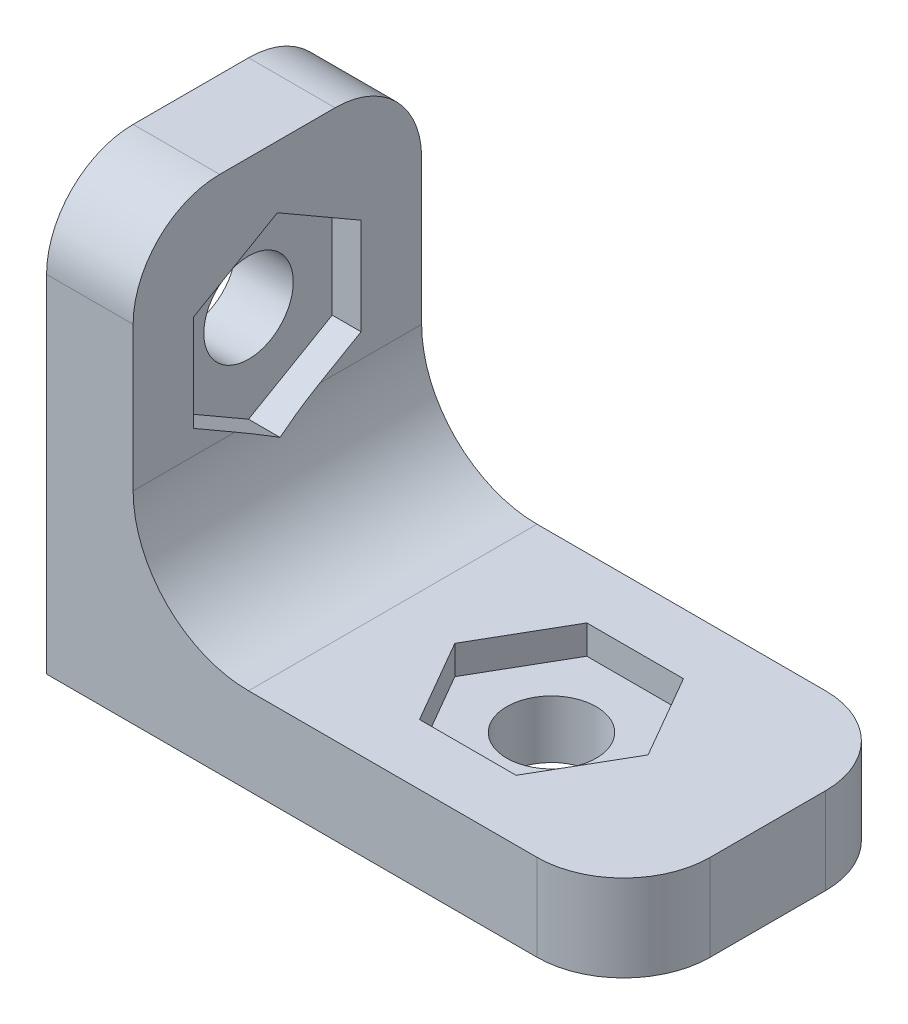
ISO-10303-21;
HEADER;
FILE_DESCRIPTION(('STEP AP214'),'2;1');
FILE_NAME('part.step','',(''),(''),'','','');
FILE_SCHEMA(('AUTOMOTIVE_DESIGN { 1 0 10303 214 1 1 1 1 }'));
ENDSEC;
DATA;
#1=APPLICATION_CONTEXT('core data for automotive mechanical design processes');
#2=APPLICATION_PROTOCOL_DEFINITION('international standard','automotive_design',2000,#1);
#3=PRODUCT_CONTEXT('',#1,'mechanical');
#4=PRODUCT('Part','Part','',(#3));
#5=PRODUCT_RELATED_PRODUCT_CATEGORY('part','',(#4));
#6=PRODUCT_DEFINITION_FORMATION('','',#4);
#7=PRODUCT_DEFINITION_CONTEXT('part definition',#1,'design');
#8=PRODUCT_DEFINITION('design','',#6,#7);
#9=PRODUCT_DEFINITION_SHAPE('','',#8);
#10=(LENGTH_UNIT() NAMED_UNIT(*) SI_UNIT(.MILLI.,.METRE.));
#11=(NAMED_UNIT(*) PLANE_ANGLE_UNIT() SI_UNIT($,.RADIAN.));
#12=(NAMED_UNIT(*) SI_UNIT($,.STERADIAN.) SOLID_ANGLE_UNIT());
#13=UNCERTAINTY_MEASURE_WITH_UNIT(LENGTH_MEASURE(1.E-05),#10,'distance_accuracy_value','');
#14=(GEOMETRIC_REPRESENTATION_CONTEXT(3) GLOBAL_UNCERTAINTY_ASSIGNED_CONTEXT((#13)) GLOBAL_UNIT_ASSIGNED_CONTEXT((#10,
#11,#12)) REPRESENTATION_CONTEXT('',''));
#15=CARTESIAN_POINT('',(0.,0.,0.));
#16=DIRECTION('',(0.,0.,1.));
#17=DIRECTION('',(1.,0.,0.));
#18=AXIS2_PLACEMENT_3D('',#15,#16,#17);
#19=CARTESIAN_POINT('',(12.5,3.,-5.));
#20=DIRECTION('',(0.,-1.,0.));
#21=DIRECTION('',(0.,0.,-1.));
#22=AXIS2_PLACEMENT_3D('',#19,#20,#21);
#23=CYLINDRICAL_SURFACE('',#22,1.55);
#24=CARTESIAN_POINT('',(12.5,0.,-5.));
#25=DIRECTION('',(0.,1.,0.));
#26=DIRECTION('',(0.,0.,1.));
#27=AXIS2_PLACEMENT_3D('',#24,#25,#26);
#28=CIRCLE('',#27,1.55);
#29=CARTESIAN_POINT('',(12.5,0.,-3.45));
#30=VERTEX_POINT('',#29);
#31=EDGE_CURVE('E311',#30,#30,#28,.T.);
#32=ORIENTED_EDGE('',*,*,#31,.F.);
#33=EDGE_LOOP('',(#32));
#34=FACE_BOUND('',#33,.T.);
#35=CARTESIAN_POINT('',(12.5,2.,-5.));
#36=DIRECTION('',(0.,1.,0.));
#37=DIRECTION('',(0.,0.,1.));
#38=AXIS2_PLACEMENT_3D('',#35,#36,#37);
#39=CIRCLE('',#38,1.55);
#40=CARTESIAN_POINT('',(12.5,2.,-3.45));
#41=VERTEX_POINT('',#40);
#42=EDGE_CURVE('E37',#41,#41,#39,.T.);
#43=ORIENTED_EDGE('',*,*,#42,.T.);
#44=EDGE_LOOP('',(#43));
#45=FACE_BOUND('',#44,.T.);
#46=ADVANCED_FACE('F33',(#34,#45),#23,.F.);
#47=CARTESIAN_POINT('',(7.3840620433566,9.5,-5.));
#48=DIRECTION('',(-1.,0.,0.));
#49=DIRECTION('',(0.,0.,1.));
#50=AXIS2_PLACEMENT_3D('',#47,#48,#49);
#51=CYLINDRICAL_SURFACE('',#50,1.55);
#52=CARTESIAN_POINT('',(0.,9.5,-5.));
#53=DIRECTION('',(-1.,0.,0.));
#54=DIRECTION('',(0.,0.,1.));
#55=AXIS2_PLACEMENT_3D('',#52,#53,#54);
#56=CIRCLE('',#55,1.55);
#57=CARTESIAN_POINT('',(0.,9.5,-3.45));
#58=VERTEX_POINT('',#57);
#59=EDGE_CURVE('E296',#58,#58,#56,.T.);
#60=ORIENTED_EDGE('',*,*,#59,.T.);
#61=EDGE_LOOP('',(#60));
#62=FACE_BOUND('',#61,.T.);
#63=CARTESIAN_POINT('',(2.,9.5,-5.));
#64=DIRECTION('',(1.,0.,0.));
#65=DIRECTION('',(0.,0.,-1.));
#66=AXIS2_PLACEMENT_3D('',#63,#64,#65);
#67=CIRCLE('',#66,1.55);
#68=CARTESIAN_POINT('',(2.,9.5,-6.55));
#69=VERTEX_POINT('',#68);
#70=EDGE_CURVE('E286',#69,#69,#67,.F.);
#71=ORIENTED_EDGE('',*,*,#70,.F.);
#72=EDGE_LOOP('',(#71));
#73=FACE_BOUND('',#72,.T.);
#74=ADVANCED_FACE('F479',(#62,#73),#51,.F.);
#75=CARTESIAN_POINT('',(0.,3.,0.));
#76=DIRECTION('',(0.,-1.,0.));
#77=DIRECTION('',(0.,0.,-1.));
#78=AXIS2_PLACEMENT_3D('',#75,#76,#77);
#79=PLANE('',#78);
#80=DIRECTION('',(-1.,0.,0.));
#81=VECTOR('',#80,1.);
#82=CARTESIAN_POINT('',(14.1743157806499,3.,-7.9));
#83=LINE('',#82,#81);
#84=CARTESIAN_POINT('',(14.1743157806499,3.,-7.9));
#85=VERTEX_POINT('',#84);
#86=CARTESIAN_POINT('',(10.8256842193501,3.,-7.9));
#87=VERTEX_POINT('',#86);
#88=EDGE_CURVE('E229',#85,#87,#83,.T.);
#89=ORIENTED_EDGE('',*,*,#88,.F.);
#90=DIRECTION('',(-0.500000000000001,0.,-0.866025403784438));
#91=VECTOR('',#90,1.);
#92=CARTESIAN_POINT('',(15.8486315612998,3.,-5.));
#93=LINE('',#92,#91);
#94=CARTESIAN_POINT('',(15.8486315612998,3.,-5.));
#95=VERTEX_POINT('',#94);
#96=EDGE_CURVE('E49',#95,#85,#93,.T.);
#97=ORIENTED_EDGE('',*,*,#96,.F.);
#98=DIRECTION('',(0.5,0.,-0.866025403784439));
#99=VECTOR('',#98,1.);
#100=CARTESIAN_POINT('',(14.1743157806499,3.,-2.1));
#101=LINE('',#100,#99);
#102=CARTESIAN_POINT('',(14.1743157806499,3.,-2.1));
#103=VERTEX_POINT('',#102);
#104=EDGE_CURVE('E215',#103,#95,#101,.T.);
#105=ORIENTED_EDGE('',*,*,#104,.F.);
#106=DIRECTION('',(1.,0.,0.));
#107=VECTOR('',#106,1.);
#108=CARTESIAN_POINT('',(10.8256842193501,3.,-2.1));
#109=LINE('',#108,#107);
#110=CARTESIAN_POINT('',(10.8256842193501,3.,-2.1));
#111=VERTEX_POINT('',#110);
#112=EDGE_CURVE('E218',#111,#103,#109,.T.);
#113=ORIENTED_EDGE('',*,*,#112,.F.);
#114=DIRECTION('',(0.5,0.,0.866025403784439));
#115=VECTOR('',#114,1.);
#116=CARTESIAN_POINT('',(9.15136843870017,3.,-5.));
#117=LINE('',#116,#115);
#118=CARTESIAN_POINT('',(9.15136843870017,3.,-5.));
#119=VERTEX_POINT('',#118);
#120=EDGE_CURVE('E234',#119,#111,#117,.T.);
#121=ORIENTED_EDGE('',*,*,#120,.F.);
#122=DIRECTION('',(-0.5,0.,0.866025403784439));
#123=VECTOR('',#122,1.);
#124=CARTESIAN_POINT('',(10.8256842193501,3.,-7.9));
#125=LINE('',#124,#123);
#126=EDGE_CURVE('E231',#87,#119,#125,.T.);
#127=ORIENTED_EDGE('',*,*,#126,.F.);
#128=EDGE_LOOP('',(#89,#97,#105,#113,#121,#127));
#129=FACE_BOUND('',#128,.T.);
#130=DIRECTION('',(-1.,0.,0.));
#131=VECTOR('',#130,1.);
#132=CARTESIAN_POINT('',(0.,3.,-10.));
#133=LINE('',#132,#131);
#134=CARTESIAN_POINT('',(17.,3.,-10.));
#135=VERTEX_POINT('',#134);
#136=CARTESIAN_POINT('',(7.,3.,-10.));
#137=VERTEX_POINT('',#136);
#138=EDGE_CURVE('E321',#135,#137,#133,.T.);
#139=ORIENTED_EDGE('',*,*,#138,.T.);
#140=DIRECTION('',(0.,0.,-1.));
#141=VECTOR('',#140,1.);
#142=CARTESIAN_POINT('',(7.,3.,0.));
#143=LINE('',#142,#141);
#144=CARTESIAN_POINT('',(7.,3.,0.));
#145=VERTEX_POINT('',#144);
#146=EDGE_CURVE('E382',#137,#145,#143,.F.);
#147=ORIENTED_EDGE('',*,*,#146,.T.);
#148=DIRECTION('',(1.,0.,0.));
#149=VECTOR('',#148,1.);
#150=CARTESIAN_POINT('',(0.,3.,0.));
#151=LINE('',#150,#149);
#152=CARTESIAN_POINT('',(17.,3.,0.));
#153=VERTEX_POINT('',#152);
#154=EDGE_CURVE('E315',#145,#153,#151,.T.);
#155=ORIENTED_EDGE('',*,*,#154,.T.);
#156=CARTESIAN_POINT('',(17.,3.,-3.));
#157=DIRECTION('',(0.,-1.,0.));
#158=DIRECTION('',(0.,0.,-1.));
#159=AXIS2_PLACEMENT_3D('',#156,#157,#158);
#160=CIRCLE('',#159,3.);
#161=CARTESIAN_POINT('',(20.,3.,-3.));
#162=VERTEX_POINT('',#161);
#163=EDGE_CURVE('E375',#153,#162,#160,.F.);
#164=ORIENTED_EDGE('',*,*,#163,.T.);
#165=DIRECTION('',(0.,0.,-1.));
#166=VECTOR('',#165,1.);
#167=CARTESIAN_POINT('',(20.,3.,0.));
#168=LINE('',#167,#166);
#169=CARTESIAN_POINT('',(20.,3.,-7.));
#170=VERTEX_POINT('',#169);
#171=EDGE_CURVE('E317',#162,#170,#168,.T.);
#172=ORIENTED_EDGE('',*,*,#171,.T.);
#173=CARTESIAN_POINT('',(17.,3.,-7.));
#174=DIRECTION('',(0.,-1.,0.));
#175=DIRECTION('',(0.,0.,-1.));
#176=AXIS2_PLACEMENT_3D('',#173,#174,#175);
#177=CIRCLE('',#176,3.);
#178=EDGE_CURVE('E373',#170,#135,#177,.F.);
#179=ORIENTED_EDGE('',*,*,#178,.T.);
#180=EDGE_LOOP('',(#139,#147,#155,#164,#172,#179));
#181=FACE_BOUND('',#180,.T.);
#182=ADVANCED_FACE('F399',(#129,#181),#79,.F.);
#183=CARTESIAN_POINT('',(0.,0.,0.));
#184=DIRECTION('',(0.,-1.,0.));
#185=DIRECTION('',(0.,0.,-1.));
#186=AXIS2_PLACEMENT_3D('',#183,#184,#185);
#187=PLANE('',#186);
#188=DIRECTION('',(0.,0.,-1.));
#189=VECTOR('',#188,1.);
#190=CARTESIAN_POINT('',(20.,0.,0.));
#191=LINE('',#190,#189);
#192=CARTESIAN_POINT('',(20.,0.,-3.));
#193=VERTEX_POINT('',#192);
#194=CARTESIAN_POINT('',(20.,0.,-7.));
#195=VERTEX_POINT('',#194);
#196=EDGE_CURVE('E330',#193,#195,#191,.T.);
#197=ORIENTED_EDGE('',*,*,#196,.F.);
#198=CARTESIAN_POINT('',(17.,0.,-3.));
#199=DIRECTION('',(0.,-1.,0.));
#200=DIRECTION('',(0.,0.,-1.));
#201=AXIS2_PLACEMENT_3D('',#198,#199,#200);
#202=CIRCLE('',#201,3.);
#203=CARTESIAN_POINT('',(17.,0.,0.));
#204=VERTEX_POINT('',#203);
#205=EDGE_CURVE('E371',#193,#204,#202,.T.);
#206=ORIENTED_EDGE('',*,*,#205,.T.);
#207=DIRECTION('',(1.,0.,0.));
#208=VECTOR('',#207,1.);
#209=CARTESIAN_POINT('',(0.,0.,0.));
#210=LINE('',#209,#208);
#211=CARTESIAN_POINT('',(0.,0.,0.));
#212=VERTEX_POINT('',#211);
#213=EDGE_CURVE('E327',#212,#204,#210,.T.);
#214=ORIENTED_EDGE('',*,*,#213,.F.);
#215=DIRECTION('',(0.,0.,1.));
#216=VECTOR('',#215,1.);
#217=CARTESIAN_POINT('',(0.,0.,0.));
#218=LINE('',#217,#216);
#219=CARTESIAN_POINT('',(0.,0.,-10.));
#220=VERTEX_POINT('',#219);
#221=EDGE_CURVE('E314',#220,#212,#218,.T.);
#222=ORIENTED_EDGE('',*,*,#221,.F.);
#223=DIRECTION('',(-1.,0.,0.));
#224=VECTOR('',#223,1.);
#225=CARTESIAN_POINT('',(0.,0.,-10.));
#226=LINE('',#225,#224);
#227=CARTESIAN_POINT('',(17.,0.,-10.));
#228=VERTEX_POINT('',#227);
#229=EDGE_CURVE('E318',#228,#220,#226,.T.);
#230=ORIENTED_EDGE('',*,*,#229,.F.);
#231=CARTESIAN_POINT('',(17.,0.,-7.));
#232=DIRECTION('',(0.,-1.,0.));
#233=DIRECTION('',(0.,0.,-1.));
#234=AXIS2_PLACEMENT_3D('',#231,#232,#233);
#235=CIRCLE('',#234,3.);
#236=EDGE_CURVE('E369',#228,#195,#235,.T.);
#237=ORIENTED_EDGE('',*,*,#236,.T.);
#238=EDGE_LOOP('',(#197,#206,#214,#222,#230,#237));
#239=FACE_BOUND('',#238,.T.);
#240=ORIENTED_EDGE('',*,*,#31,.T.);
#241=EDGE_LOOP('',(#240));
#242=FACE_BOUND('',#241,.T.);
#243=ADVANCED_FACE('F428',(#239,#242),#187,.T.);
#244=CARTESIAN_POINT('',(0.,3.,0.));
#245=DIRECTION('',(1.,0.,0.));
#246=DIRECTION('',(0.,0.,-1.));
#247=AXIS2_PLACEMENT_3D('',#244,#245,#246);
#248=PLANE('',#247);
#249=ORIENTED_EDGE('',*,*,#59,.F.);
#250=EDGE_LOOP('',(#249));
#251=FACE_BOUND('',#250,.T.);
#252=DIRECTION('',(0.,0.,1.));
#253=VECTOR('',#252,1.);
#254=CARTESIAN_POINT('',(0.,15.,-10.));
#255=LINE('',#254,#253);
#256=CARTESIAN_POINT('',(0.,15.,-7.));
#257=VERTEX_POINT('',#256);
#258=CARTESIAN_POINT('',(0.,15.,-3.));
#259=VERTEX_POINT('',#258);
#260=EDGE_CURVE('E299',#257,#259,#255,.T.);
#261=ORIENTED_EDGE('',*,*,#260,.F.);
#262=CARTESIAN_POINT('',(0.,12.,-7.));
#263=DIRECTION('',(1.,0.,0.));
#264=DIRECTION('',(0.,0.,-1.));
#265=AXIS2_PLACEMENT_3D('',#262,#263,#264);
#266=CIRCLE('',#265,3.);
#267=CARTESIAN_POINT('',(0.,12.,-10.));
#268=VERTEX_POINT('',#267);
#269=EDGE_CURVE('E348',#257,#268,#266,.F.);
#270=ORIENTED_EDGE('',*,*,#269,.T.);
#271=DIRECTION('',(0.,-1.,0.));
#272=VECTOR('',#271,1.);
#273=CARTESIAN_POINT('',(0.,3.,-10.));
#274=LINE('',#273,#272);
#275=EDGE_CURVE('E324',#268,#220,#274,.T.);
#276=ORIENTED_EDGE('',*,*,#275,.T.);
#277=ORIENTED_EDGE('',*,*,#221,.T.);
#278=DIRECTION('',(0.,-1.,0.));
#279=VECTOR('',#278,1.);
#280=CARTESIAN_POINT('',(0.,3.,0.));
#281=LINE('',#280,#279);
#282=CARTESIAN_POINT('',(0.,12.,0.));
#283=VERTEX_POINT('',#282);
#284=EDGE_CURVE('E336',#283,#212,#281,.T.);
#285=ORIENTED_EDGE('',*,*,#284,.F.);
#286=CARTESIAN_POINT('',(0.,12.,-3.));
#287=DIRECTION('',(1.,0.,0.));
#288=DIRECTION('',(0.,0.,-1.));
#289=AXIS2_PLACEMENT_3D('',#286,#287,#288);
#290=CIRCLE('',#289,3.);
#291=EDGE_CURVE('E346',#283,#259,#290,.F.);
#292=ORIENTED_EDGE('',*,*,#291,.T.);
#293=EDGE_LOOP('',(#261,#270,#276,#277,#285,#292));
#294=FACE_BOUND('',#293,.T.);
#295=ADVANCED_FACE('F421',(#251,#294),#248,.F.);
#296=CARTESIAN_POINT('',(0.,3.,0.));
#297=DIRECTION('',(0.,0.,-1.));
#298=DIRECTION('',(-1.,0.,0.));
#299=AXIS2_PLACEMENT_3D('',#296,#297,#298);
#300=PLANE('',#299);
#301=DIRECTION('',(0.,-1.,0.));
#302=VECTOR('',#301,1.);
#303=CARTESIAN_POINT('',(3.,15.,0.));
#304=LINE('',#303,#302);
#305=CARTESIAN_POINT('',(3.,12.,0.));
#306=VERTEX_POINT('',#305);
#307=CARTESIAN_POINT('',(3.,7.,0.));
#308=VERTEX_POINT('',#307);
#309=EDGE_CURVE('E308',#306,#308,#304,.T.);
#310=ORIENTED_EDGE('',*,*,#309,.F.);
#311=DIRECTION('',(1.,0.,0.));
#312=VECTOR('',#311,1.);
#313=CARTESIAN_POINT('',(0.,12.,0.));
#314=LINE('',#313,#312);
#315=EDGE_CURVE('E362',#306,#283,#314,.F.);
#316=ORIENTED_EDGE('',*,*,#315,.T.);
#317=ORIENTED_EDGE('',*,*,#284,.T.);
#318=ORIENTED_EDGE('',*,*,#213,.T.);
#319=DIRECTION('',(0.,-1.,0.));
#320=VECTOR('',#319,1.);
#321=CARTESIAN_POINT('',(17.,3.,0.));
#322=LINE('',#321,#320);
#323=EDGE_CURVE('E359',#204,#153,#322,.F.);
#324=ORIENTED_EDGE('',*,*,#323,.T.);
#325=ORIENTED_EDGE('',*,*,#154,.F.);
#326=CARTESIAN_POINT('',(7.,7.,0.));
#327=DIRECTION('',(0.,0.,-1.));
#328=DIRECTION('',(-1.,0.,0.));
#329=AXIS2_PLACEMENT_3D('',#326,#327,#328);
#330=CIRCLE('',#329,4.);
#331=EDGE_CURVE('E11',#145,#308,#330,.T.);
#332=ORIENTED_EDGE('',*,*,#331,.T.);
#333=EDGE_LOOP('',(#310,#316,#317,#318,#324,#325,#332));
#334=FACE_BOUND('',#333,.T.);
#335=ADVANCED_FACE('F406',(#334),#300,.F.);
#336=CARTESIAN_POINT('',(20.,3.,0.));
#337=DIRECTION('',(-1.,0.,0.));
#338=DIRECTION('',(0.,0.,1.));
#339=AXIS2_PLACEMENT_3D('',#336,#337,#338);
#340=PLANE('',#339);
#341=ORIENTED_EDGE('',*,*,#171,.F.);
#342=DIRECTION('',(0.,-1.,0.));
#343=VECTOR('',#342,1.);
#344=CARTESIAN_POINT('',(20.,3.,-3.));
#345=LINE('',#344,#343);
#346=EDGE_CURVE('E366',#162,#193,#345,.T.);
#347=ORIENTED_EDGE('',*,*,#346,.T.);
#348=ORIENTED_EDGE('',*,*,#196,.T.);
#349=DIRECTION('',(0.,-1.,0.));
#350=VECTOR('',#349,1.);
#351=CARTESIAN_POINT('',(20.,3.,-7.));
#352=LINE('',#351,#350);
#353=EDGE_CURVE('E364',#195,#170,#352,.F.);
#354=ORIENTED_EDGE('',*,*,#353,.T.);
#355=EDGE_LOOP('',(#341,#347,#348,#354));
#356=FACE_BOUND('',#355,.T.);
#357=ADVANCED_FACE('F437',(#356),#340,.F.);
#358=CARTESIAN_POINT('',(0.,3.,-10.));
#359=DIRECTION('',(0.,0.,1.));
#360=DIRECTION('',(1.,0.,0.));
#361=AXIS2_PLACEMENT_3D('',#358,#359,#360);
#362=PLANE('',#361);
#363=ORIENTED_EDGE('',*,*,#275,.F.);
#364=DIRECTION('',(-1.,0.,0.));
#365=VECTOR('',#364,1.);
#366=CARTESIAN_POINT('',(3.,12.,-10.));
#367=LINE('',#366,#365);
#368=CARTESIAN_POINT('',(3.,12.,-10.));
#369=VERTEX_POINT('',#368);
#370=EDGE_CURVE('E353',#268,#369,#367,.F.);
#371=ORIENTED_EDGE('',*,*,#370,.T.);
#372=DIRECTION('',(0.,-1.,0.));
#373=VECTOR('',#372,1.);
#374=CARTESIAN_POINT('',(3.,15.,-10.));
#375=LINE('',#374,#373);
#376=CARTESIAN_POINT('',(3.,7.,-10.));
#377=VERTEX_POINT('',#376);
#378=EDGE_CURVE('E305',#369,#377,#375,.T.);
#379=ORIENTED_EDGE('',*,*,#378,.T.);
#380=CARTESIAN_POINT('',(7.,7.,-10.));
#381=DIRECTION('',(0.,0.,1.));
#382=DIRECTION('',(1.,0.,0.));
#383=AXIS2_PLACEMENT_3D('',#380,#381,#382);
#384=CIRCLE('',#383,4.);
#385=EDGE_CURVE('E42',#377,#137,#384,.T.);
#386=ORIENTED_EDGE('',*,*,#385,.T.);
#387=ORIENTED_EDGE('',*,*,#138,.F.);
#388=DIRECTION('',(0.,-1.,0.));
#389=VECTOR('',#388,1.);
#390=CARTESIAN_POINT('',(17.,3.,-10.));
#391=LINE('',#390,#389);
#392=EDGE_CURVE('E350',#135,#228,#391,.T.);
#393=ORIENTED_EDGE('',*,*,#392,.T.);
#394=ORIENTED_EDGE('',*,*,#229,.T.);
#395=EDGE_LOOP('',(#363,#371,#379,#386,#387,#393,#394));
#396=FACE_BOUND('',#395,.T.);
#397=ADVANCED_FACE('F392',(#396),#362,.F.);
#398=CARTESIAN_POINT('',(3.,15.,-10.));
#399=DIRECTION('',(-1.,0.,0.));
#400=DIRECTION('',(0.,0.,1.));
#401=AXIS2_PLACEMENT_3D('',#398,#399,#400);
#402=PLANE('',#401);
#403=ORIENTED_EDGE('',*,*,#309,.T.);
#404=DIRECTION('',(0.,0.,-1.));
#405=VECTOR('',#404,1.);
#406=CARTESIAN_POINT('',(3.,7.,-10.));
#407=LINE('',#406,#405);
#408=CARTESIAN_POINT('',(3.,7.,-3.5301270189222));
#409=VERTEX_POINT('',#408);
#410=EDGE_CURVE('E379',#308,#409,#407,.T.);
#411=ORIENTED_EDGE('',*,*,#410,.T.);
#412=DIRECTION('',(0.,-0.500000000000001,-0.866025403784438));
#413=VECTOR('',#412,1.);
#414=CARTESIAN_POINT('',(3.,7.82568421935009,-2.1));
#415=LINE('',#414,#413);
#416=CARTESIAN_POINT('',(3.,7.82568421935009,-2.1));
#417=VERTEX_POINT('',#416);
#418=EDGE_CURVE('E279',#417,#409,#415,.T.);
#419=ORIENTED_EDGE('',*,*,#418,.F.);
#420=DIRECTION('',(0.,-1.,0.));
#421=VECTOR('',#420,1.);
#422=CARTESIAN_POINT('',(3.,11.1743157806499,-2.1));
#423=LINE('',#422,#421);
#424=CARTESIAN_POINT('',(3.,11.1743157806499,-2.1));
#425=VERTEX_POINT('',#424);
#426=EDGE_CURVE('E276',#425,#417,#423,.T.);
#427=ORIENTED_EDGE('',*,*,#426,.F.);
#428=DIRECTION('',(0.,-0.5,0.866025403784439));
#429=VECTOR('',#428,1.);
#430=CARTESIAN_POINT('',(3.,12.8486315612998,-5.));
#431=LINE('',#430,#429);
#432=CARTESIAN_POINT('',(3.,12.8486315612998,-5.));
#433=VERTEX_POINT('',#432);
#434=EDGE_CURVE('E273',#433,#425,#431,.T.);
#435=ORIENTED_EDGE('',*,*,#434,.F.);
#436=DIRECTION('',(0.,0.5,0.866025403784438));
#437=VECTOR('',#436,1.);
#438=CARTESIAN_POINT('',(3.,11.1743157806499,-7.89999999999999));
#439=LINE('',#438,#437);
#440=CARTESIAN_POINT('',(3.,11.1743157806499,-7.89999999999999));
#441=VERTEX_POINT('',#440);
#442=EDGE_CURVE('E270',#441,#433,#439,.T.);
#443=ORIENTED_EDGE('',*,*,#442,.F.);
#444=DIRECTION('',(0.,1.,0.));
#445=VECTOR('',#444,1.);
#446=CARTESIAN_POINT('',(3.,7.82568421935009,-7.89999999999999));
#447=LINE('',#446,#445);
#448=CARTESIAN_POINT('',(3.,7.82568421935009,-7.89999999999999));
#449=VERTEX_POINT('',#448);
#450=EDGE_CURVE('E268',#449,#441,#447,.T.);
#451=ORIENTED_EDGE('',*,*,#450,.F.);
#452=DIRECTION('',(0.,0.5,-0.866025403784439));
#453=VECTOR('',#452,1.);
#454=CARTESIAN_POINT('',(3.,6.15136843870017,-5.));
#455=LINE('',#454,#453);
#456=CARTESIAN_POINT('',(3.,7.,-6.4698729810778));
#457=VERTEX_POINT('',#456);
#458=EDGE_CURVE('E252',#457,#449,#455,.T.);
#459=ORIENTED_EDGE('',*,*,#458,.F.);
#460=DIRECTION('',(0.,0.,-1.));
#461=VECTOR('',#460,1.);
#462=CARTESIAN_POINT('',(3.,7.,-10.));
#463=LINE('',#462,#461);
#464=EDGE_CURVE('E377',#457,#377,#463,.T.);
#465=ORIENTED_EDGE('',*,*,#464,.T.);
#466=ORIENTED_EDGE('',*,*,#378,.F.);
#467=CARTESIAN_POINT('',(3.,12.,-7.));
#468=DIRECTION('',(-1.,0.,0.));
#469=DIRECTION('',(0.,0.,1.));
#470=AXIS2_PLACEMENT_3D('',#467,#468,#469);
#471=CIRCLE('',#470,3.);
#472=CARTESIAN_POINT('',(3.,15.,-7.));
#473=VERTEX_POINT('',#472);
#474=EDGE_CURVE('E357',#369,#473,#471,.F.);
#475=ORIENTED_EDGE('',*,*,#474,.T.);
#476=DIRECTION('',(0.,0.,-1.));
#477=VECTOR('',#476,1.);
#478=CARTESIAN_POINT('',(3.,15.,-10.));
#479=LINE('',#478,#477);
#480=CARTESIAN_POINT('',(3.,15.,-3.));
#481=VERTEX_POINT('',#480);
#482=EDGE_CURVE('E302',#481,#473,#479,.T.);
#483=ORIENTED_EDGE('',*,*,#482,.F.);
#484=CARTESIAN_POINT('',(3.,12.,-3.));
#485=DIRECTION('',(-1.,0.,0.));
#486=DIRECTION('',(0.,0.,1.));
#487=AXIS2_PLACEMENT_3D('',#484,#485,#486);
#488=CIRCLE('',#487,3.);
#489=EDGE_CURVE('E355',#481,#306,#488,.F.);
#490=ORIENTED_EDGE('',*,*,#489,.T.);
#491=EDGE_LOOP('',(#403,#411,#419,#427,#435,#443,#451,#459,#465,#466,#475,#483,#490));
#492=FACE_BOUND('',#491,.T.);
#493=ADVANCED_FACE('F409',(#492),#402,.F.);
#494=CARTESIAN_POINT('',(0.,15.,0.));
#495=DIRECTION('',(0.,1.,0.));
#496=DIRECTION('',(0.,0.,1.));
#497=AXIS2_PLACEMENT_3D('',#494,#495,#496);
#498=PLANE('',#497);
#499=ORIENTED_EDGE('',*,*,#482,.T.);
#500=DIRECTION('',(-1.,0.,0.));
#501=VECTOR('',#500,1.);
#502=CARTESIAN_POINT('',(0.,15.,-7.));
#503=LINE('',#502,#501);
#504=EDGE_CURVE('E343',#473,#257,#503,.T.);
#505=ORIENTED_EDGE('',*,*,#504,.T.);
#506=ORIENTED_EDGE('',*,*,#260,.T.);
#507=DIRECTION('',(1.,0.,0.));
#508=VECTOR('',#507,1.);
#509=CARTESIAN_POINT('',(3.,15.,-3.));
#510=LINE('',#509,#508);
#511=EDGE_CURVE('E338',#259,#481,#510,.T.);
#512=ORIENTED_EDGE('',*,*,#511,.T.);
#513=EDGE_LOOP('',(#499,#505,#506,#512));
#514=FACE_BOUND('',#513,.T.);
#515=ADVANCED_FACE('F417',(#514),#498,.T.);
#516=CARTESIAN_POINT('',(2.,0.,0.));
#517=DIRECTION('',(1.,0.,0.));
#518=DIRECTION('',(0.,0.,-1.));
#519=AXIS2_PLACEMENT_3D('',#516,#517,#518);
#520=PLANE('',#519);
#521=DIRECTION('',(0.,1.,0.));
#522=VECTOR('',#521,1.);
#523=CARTESIAN_POINT('',(2.,7.82568421935009,-7.89999999999999));
#524=LINE('',#523,#522);
#525=CARTESIAN_POINT('',(2.,7.82568421935009,-7.89999999999999));
#526=VERTEX_POINT('',#525);
#527=CARTESIAN_POINT('',(2.,11.1743157806499,-7.89999999999999));
#528=VERTEX_POINT('',#527);
#529=EDGE_CURVE('E248',#526,#528,#524,.T.);
#530=ORIENTED_EDGE('',*,*,#529,.T.);
#531=DIRECTION('',(0.,0.5,0.866025403784438));
#532=VECTOR('',#531,1.);
#533=CARTESIAN_POINT('',(2.,11.1743157806499,-7.89999999999999));
#534=LINE('',#533,#532);
#535=CARTESIAN_POINT('',(2.,12.8486315612998,-5.));
#536=VERTEX_POINT('',#535);
#537=EDGE_CURVE('E251',#528,#536,#534,.T.);
#538=ORIENTED_EDGE('',*,*,#537,.T.);
#539=DIRECTION('',(0.,-0.5,0.866025403784439));
#540=VECTOR('',#539,1.);
#541=CARTESIAN_POINT('',(2.,12.8486315612998,-5.));
#542=LINE('',#541,#540);
#543=CARTESIAN_POINT('',(2.,11.1743157806499,-2.1));
#544=VERTEX_POINT('',#543);
#545=EDGE_CURVE('E255',#536,#544,#542,.T.);
#546=ORIENTED_EDGE('',*,*,#545,.T.);
#547=DIRECTION('',(0.,-1.,0.));
#548=VECTOR('',#547,1.);
#549=CARTESIAN_POINT('',(2.,11.1743157806499,-2.1));
#550=LINE('',#549,#548);
#551=CARTESIAN_POINT('',(2.,7.82568421935009,-2.1));
#552=VERTEX_POINT('',#551);
#553=EDGE_CURVE('E258',#544,#552,#550,.T.);
#554=ORIENTED_EDGE('',*,*,#553,.T.);
#555=DIRECTION('',(0.,-0.500000000000001,-0.866025403784438));
#556=VECTOR('',#555,1.);
#557=CARTESIAN_POINT('',(2.,7.82568421935009,-2.1));
#558=LINE('',#557,#556);
#559=CARTESIAN_POINT('',(2.,6.15136843870017,-5.));
#560=VERTEX_POINT('',#559);
#561=EDGE_CURVE('E261',#552,#560,#558,.T.);
#562=ORIENTED_EDGE('',*,*,#561,.T.);
#563=DIRECTION('',(0.,0.5,-0.866025403784439));
#564=VECTOR('',#563,1.);
#565=CARTESIAN_POINT('',(2.,6.15136843870017,-5.));
#566=LINE('',#565,#564);
#567=EDGE_CURVE('E264',#560,#526,#566,.T.);
#568=ORIENTED_EDGE('',*,*,#567,.T.);
#569=EDGE_LOOP('',(#530,#538,#546,#554,#562,#568));
#570=FACE_BOUND('',#569,.T.);
#571=ORIENTED_EDGE('',*,*,#70,.T.);
#572=EDGE_LOOP('',(#571));
#573=FACE_BOUND('',#572,.T.);
#574=ADVANCED_FACE('F460',(#570,#573),#520,.T.);
#575=CARTESIAN_POINT('',(2.,7.82568421935009,-7.89999999999999));
#576=DIRECTION('',(0.,0.,-1.));
#577=DIRECTION('',(-1.,0.,0.));
#578=AXIS2_PLACEMENT_3D('',#575,#576,#577);
#579=PLANE('',#578);
#580=ORIENTED_EDGE('',*,*,#450,.T.);
#581=DIRECTION('',(1.,0.,0.));
#582=VECTOR('',#581,1.);
#583=CARTESIAN_POINT('',(2.,11.1743157806499,-7.89999999999999));
#584=LINE('',#583,#582);
#585=EDGE_CURVE('E267',#528,#441,#584,.T.);
#586=ORIENTED_EDGE('',*,*,#585,.F.);
#587=ORIENTED_EDGE('',*,*,#529,.F.);
#588=DIRECTION('',(1.,0.,0.));
#589=VECTOR('',#588,1.);
#590=CARTESIAN_POINT('',(2.,7.82568421935009,-7.89999999999999));
#591=LINE('',#590,#589);
#592=EDGE_CURVE('E283',#526,#449,#591,.T.);
#593=ORIENTED_EDGE('',*,*,#592,.T.);
#594=EDGE_LOOP('',(#580,#586,#587,#593));
#595=FACE_BOUND('',#594,.T.);
#596=ADVANCED_FACE('F451',(#595),#579,.F.);
#597=CARTESIAN_POINT('',(2.,6.15136843870017,-5.));
#598=DIRECTION('',(0.,-0.866025403784439,-0.5));
#599=DIRECTION('',(0.,0.5,-0.866025403784439));
#600=AXIS2_PLACEMENT_3D('',#597,#598,#599);
#601=PLANE('',#600);
#602=DIRECTION('',(1.,0.,0.));
#603=VECTOR('',#602,1.);
#604=CARTESIAN_POINT('',(2.,6.15136843870017,-5.));
#605=LINE('',#604,#603);
#606=CARTESIAN_POINT('',(3.09105839476134,6.15136843870017,-5.));
#607=VERTEX_POINT('',#606);
#608=EDGE_CURVE('E57',#560,#607,#605,.T.);
#609=ORIENTED_EDGE('',*,*,#608,.T.);
#610=CARTESIAN_POINT('',(7.,7.,-6.4698729810778));
#611=DIRECTION('',(0.,-0.866025403784439,-0.5));
#612=DIRECTION('',(0.,-0.5,0.866025403784439));
#613=AXIS2_PLACEMENT_3D('',#610,#611,#612);
#614=ELLIPSE('',#613,8.,4.);
#615=EDGE_CURVE('E386',#607,#457,#614,.T.);
#616=ORIENTED_EDGE('',*,*,#615,.T.);
#617=ORIENTED_EDGE('',*,*,#458,.T.);
#618=ORIENTED_EDGE('',*,*,#592,.F.);
#619=ORIENTED_EDGE('',*,*,#567,.F.);
#620=EDGE_LOOP('',(#609,#616,#617,#618,#619));
#621=FACE_BOUND('',#620,.T.);
#622=ADVANCED_FACE('F448',(#621),#601,.F.);
#623=CARTESIAN_POINT('',(2.,7.82568421935009,-2.1));
#624=DIRECTION('',(0.,-0.866025403784438,0.500000000000001));
#625=DIRECTION('',(0.,-0.500000000000001,-0.866025403784438));
#626=AXIS2_PLACEMENT_3D('',#623,#624,#625);
#627=PLANE('',#626);
#628=ORIENTED_EDGE('',*,*,#418,.T.);
#629=CARTESIAN_POINT('',(7.,7.,-3.5301270189222));
#630=DIRECTION('',(0.,-0.866025403784438,0.500000000000001));
#631=DIRECTION('',(0.,0.500000000000001,0.866025403784438));
#632=AXIS2_PLACEMENT_3D('',#629,#630,#631);
#633=ELLIPSE('',#632,7.99999999999999,4.);
#634=EDGE_CURVE('E384',#409,#607,#633,.T.);
#635=ORIENTED_EDGE('',*,*,#634,.T.);
#636=ORIENTED_EDGE('',*,*,#608,.F.);
#637=ORIENTED_EDGE('',*,*,#561,.F.);
#638=DIRECTION('',(1.,0.,0.));
#639=VECTOR('',#638,1.);
#640=CARTESIAN_POINT('',(2.,7.82568421935009,-2.1));
#641=LINE('',#640,#639);
#642=EDGE_CURVE('E288',#552,#417,#641,.T.);
#643=ORIENTED_EDGE('',*,*,#642,.T.);
#644=EDGE_LOOP('',(#628,#635,#636,#637,#643));
#645=FACE_BOUND('',#644,.T.);
#646=ADVANCED_FACE('F465',(#645),#627,.F.);
#647=CARTESIAN_POINT('',(2.,11.1743157806499,-2.1));
#648=DIRECTION('',(0.,0.,1.));
#649=DIRECTION('',(0.,-1.,0.));
#650=AXIS2_PLACEMENT_3D('',#647,#648,#649);
#651=PLANE('',#650);
#652=ORIENTED_EDGE('',*,*,#426,.T.);
#653=ORIENTED_EDGE('',*,*,#642,.F.);
#654=ORIENTED_EDGE('',*,*,#553,.F.);
#655=DIRECTION('',(1.,0.,0.));
#656=VECTOR('',#655,1.);
#657=CARTESIAN_POINT('',(2.,11.1743157806499,-2.1));
#658=LINE('',#657,#656);
#659=EDGE_CURVE('E290',#544,#425,#658,.T.);
#660=ORIENTED_EDGE('',*,*,#659,.T.);
#661=EDGE_LOOP('',(#652,#653,#654,#660));
#662=FACE_BOUND('',#661,.T.);
#663=ADVANCED_FACE('F467',(#662),#651,.F.);
#664=CARTESIAN_POINT('',(2.,12.8486315612998,-5.));
#665=DIRECTION('',(0.,0.866025403784439,0.5));
#666=DIRECTION('',(0.,-0.5,0.866025403784439));
#667=AXIS2_PLACEMENT_3D('',#664,#665,#666);
#668=PLANE('',#667);
#669=ORIENTED_EDGE('',*,*,#434,.T.);
#670=ORIENTED_EDGE('',*,*,#659,.F.);
#671=ORIENTED_EDGE('',*,*,#545,.F.);
#672=DIRECTION('',(1.,0.,0.));
#673=VECTOR('',#672,1.);
#674=CARTESIAN_POINT('',(2.,12.8486315612998,-5.));
#675=LINE('',#674,#673);
#676=EDGE_CURVE('E292',#536,#433,#675,.T.);
#677=ORIENTED_EDGE('',*,*,#676,.T.);
#678=EDGE_LOOP('',(#669,#670,#671,#677));
#679=FACE_BOUND('',#678,.T.);
#680=ADVANCED_FACE('F469',(#679),#668,.F.);
#681=CARTESIAN_POINT('',(2.,11.1743157806499,-7.89999999999999));
#682=DIRECTION('',(0.,0.866025403784438,-0.500000000000001));
#683=DIRECTION('',(0.,0.500000000000001,0.866025403784438));
#684=AXIS2_PLACEMENT_3D('',#681,#682,#683);
#685=PLANE('',#684);
#686=ORIENTED_EDGE('',*,*,#442,.T.);
#687=ORIENTED_EDGE('',*,*,#676,.F.);
#688=ORIENTED_EDGE('',*,*,#537,.F.);
#689=ORIENTED_EDGE('',*,*,#585,.T.);
#690=EDGE_LOOP('',(#686,#687,#688,#689));
#691=FACE_BOUND('',#690,.T.);
#692=ADVANCED_FACE('F456',(#691),#685,.F.);
#693=CARTESIAN_POINT('',(0.,12.,-7.));
#694=DIRECTION('',(1.,0.,0.));
#695=DIRECTION('',(0.,0.,-1.));
#696=AXIS2_PLACEMENT_3D('',#693,#694,#695);
#697=CYLINDRICAL_SURFACE('',#696,3.);
#698=ORIENTED_EDGE('',*,*,#474,.F.);
#699=ORIENTED_EDGE('',*,*,#370,.F.);
#700=ORIENTED_EDGE('',*,*,#269,.F.);
#701=ORIENTED_EDGE('',*,*,#504,.F.);
#702=EDGE_LOOP('',(#698,#699,#700,#701));
#703=FACE_BOUND('',#702,.T.);
#704=ADVANCED_FACE('F444',(#703),#697,.T.);
#705=CARTESIAN_POINT('',(0.,12.,-3.));
#706=DIRECTION('',(-1.,0.,0.));
#707=DIRECTION('',(0.,0.,1.));
#708=AXIS2_PLACEMENT_3D('',#705,#706,#707);
#709=CYLINDRICAL_SURFACE('',#708,3.);
#710=ORIENTED_EDGE('',*,*,#291,.F.);
#711=ORIENTED_EDGE('',*,*,#315,.F.);
#712=ORIENTED_EDGE('',*,*,#489,.F.);
#713=ORIENTED_EDGE('',*,*,#511,.F.);
#714=EDGE_LOOP('',(#710,#711,#712,#713));
#715=FACE_BOUND('',#714,.T.);
#716=ADVANCED_FACE('F415',(#715),#709,.T.);
#717=CARTESIAN_POINT('',(17.,3.,-3.));
#718=DIRECTION('',(0.,-1.,0.));
#719=DIRECTION('',(0.,0.,-1.));
#720=AXIS2_PLACEMENT_3D('',#717,#718,#719);
#721=CYLINDRICAL_SURFACE('',#720,3.);
#722=ORIENTED_EDGE('',*,*,#163,.F.);
#723=ORIENTED_EDGE('',*,*,#323,.F.);
#724=ORIENTED_EDGE('',*,*,#205,.F.);
#725=ORIENTED_EDGE('',*,*,#346,.F.);
#726=EDGE_LOOP('',(#722,#723,#724,#725));
#727=FACE_BOUND('',#726,.T.);
#728=ADVANCED_FACE('F434',(#727),#721,.T.);
#729=CARTESIAN_POINT('',(17.,3.,-7.));
#730=DIRECTION('',(0.,-1.,0.));
#731=DIRECTION('',(0.,0.,-1.));
#732=AXIS2_PLACEMENT_3D('',#729,#730,#731);
#733=CYLINDRICAL_SURFACE('',#732,3.);
#734=ORIENTED_EDGE('',*,*,#178,.F.);
#735=ORIENTED_EDGE('',*,*,#353,.F.);
#736=ORIENTED_EDGE('',*,*,#236,.F.);
#737=ORIENTED_EDGE('',*,*,#392,.F.);
#738=EDGE_LOOP('',(#734,#735,#736,#737));
#739=FACE_BOUND('',#738,.T.);
#740=ADVANCED_FACE('F440',(#739),#733,.T.);
#741=CARTESIAN_POINT('',(7.,7.,-10.));
#742=DIRECTION('',(0.,0.,1.));
#743=DIRECTION('',(1.,0.,0.));
#744=AXIS2_PLACEMENT_3D('',#741,#742,#743);
#745=CYLINDRICAL_SURFACE('',#744,4.);
#746=ORIENTED_EDGE('',*,*,#331,.F.);
#747=ORIENTED_EDGE('',*,*,#146,.F.);
#748=ORIENTED_EDGE('',*,*,#385,.F.);
#749=ORIENTED_EDGE('',*,*,#464,.F.);
#750=ORIENTED_EDGE('',*,*,#615,.F.);
#751=ORIENTED_EDGE('',*,*,#634,.F.);
#752=ORIENTED_EDGE('',*,*,#410,.F.);
#753=EDGE_LOOP('',(#746,#747,#748,#749,#750,#751,#752));
#754=FACE_BOUND('',#753,.T.);
#755=ADVANCED_FACE('F35',(#754),#745,.F.);
#756=CARTESIAN_POINT('',(15.8486315612998,2.,-5.));
#757=DIRECTION('',(0.866025403784438,0.,-0.500000000000001));
#758=DIRECTION('',(-0.500000000000001,0.,-0.866025403784438));
#759=AXIS2_PLACEMENT_3D('',#756,#757,#758);
#760=PLANE('',#759);
#761=ORIENTED_EDGE('',*,*,#96,.T.);
#762=DIRECTION('',(0.,1.,0.));
#763=VECTOR('',#762,1.);
#764=CARTESIAN_POINT('',(14.1743157806499,2.,-7.9));
#765=LINE('',#764,#763);
#766=CARTESIAN_POINT('',(14.1743157806499,2.,-7.9));
#767=VERTEX_POINT('',#766);
#768=EDGE_CURVE('E192',#767,#85,#765,.T.);
#769=ORIENTED_EDGE('',*,*,#768,.F.);
#770=DIRECTION('',(-0.500000000000001,0.,-0.866025403784438));
#771=VECTOR('',#770,1.);
#772=CARTESIAN_POINT('',(15.8486315612998,2.,-5.));
#773=LINE('',#772,#771);
#774=CARTESIAN_POINT('',(15.8486315612998,2.,-5.));
#775=VERTEX_POINT('',#774);
#776=EDGE_CURVE('E196',#775,#767,#773,.T.);
#777=ORIENTED_EDGE('',*,*,#776,.F.);
#778=DIRECTION('',(0.,1.,0.));
#779=VECTOR('',#778,1.);
#780=CARTESIAN_POINT('',(15.8486315612998,2.,-5.));
#781=LINE('',#780,#779);
#782=EDGE_CURVE('E239',#775,#95,#781,.T.);
#783=ORIENTED_EDGE('',*,*,#782,.T.);
#784=EDGE_LOOP('',(#761,#769,#777,#783));
#785=FACE_BOUND('',#784,.T.);
#786=ADVANCED_FACE('F194',(#785),#760,.F.);
#787=CARTESIAN_POINT('',(14.1743157806499,2.,-2.1));
#788=DIRECTION('',(0.866025403784439,0.,0.5));
#789=DIRECTION('',(0.5,0.,-0.866025403784439));
#790=AXIS2_PLACEMENT_3D('',#787,#788,#789);
#791=PLANE('',#790);
#792=ORIENTED_EDGE('',*,*,#104,.T.);
#793=ORIENTED_EDGE('',*,*,#782,.F.);
#794=DIRECTION('',(0.5,0.,-0.866025403784439));
#795=VECTOR('',#794,1.);
#796=CARTESIAN_POINT('',(14.1743157806499,2.,-2.1));
#797=LINE('',#796,#795);
#798=CARTESIAN_POINT('',(14.1743157806499,2.,-2.1));
#799=VERTEX_POINT('',#798);
#800=EDGE_CURVE('E202',#799,#775,#797,.T.);
#801=ORIENTED_EDGE('',*,*,#800,.F.);
#802=DIRECTION('',(0.,1.,0.));
#803=VECTOR('',#802,1.);
#804=CARTESIAN_POINT('',(14.1743157806499,2.,-2.1));
#805=LINE('',#804,#803);
#806=EDGE_CURVE('E241',#799,#103,#805,.T.);
#807=ORIENTED_EDGE('',*,*,#806,.T.);
#808=EDGE_LOOP('',(#792,#793,#801,#807));
#809=FACE_BOUND('',#808,.T.);
#810=ADVANCED_FACE('F518',(#809),#791,.F.);
#811=CARTESIAN_POINT('',(10.8256842193501,2.,-2.1));
#812=DIRECTION('',(0.,0.,1.));
#813=DIRECTION('',(1.,0.,0.));
#814=AXIS2_PLACEMENT_3D('',#811,#812,#813);
#815=PLANE('',#814);
#816=ORIENTED_EDGE('',*,*,#112,.T.);
#817=ORIENTED_EDGE('',*,*,#806,.F.);
#818=DIRECTION('',(1.,0.,0.));
#819=VECTOR('',#818,1.);
#820=CARTESIAN_POINT('',(10.8256842193501,2.,-2.1));
#821=LINE('',#820,#819);
#822=CARTESIAN_POINT('',(10.8256842193501,2.,-2.1));
#823=VERTEX_POINT('',#822);
#824=EDGE_CURVE('E225',#823,#799,#821,.T.);
#825=ORIENTED_EDGE('',*,*,#824,.F.);
#826=DIRECTION('',(0.,1.,0.));
#827=VECTOR('',#826,1.);
#828=CARTESIAN_POINT('',(10.8256842193501,2.,-2.1));
#829=LINE('',#828,#827);
#830=EDGE_CURVE('E243',#823,#111,#829,.T.);
#831=ORIENTED_EDGE('',*,*,#830,.T.);
#832=EDGE_LOOP('',(#816,#817,#825,#831));
#833=FACE_BOUND('',#832,.T.);
#834=ADVANCED_FACE('F523',(#833),#815,.F.);
#835=CARTESIAN_POINT('',(9.15136843870017,2.,-5.));
#836=DIRECTION('',(-0.866025403784439,0.,0.5));
#837=DIRECTION('',(0.5,0.,0.866025403784439));
#838=AXIS2_PLACEMENT_3D('',#835,#836,#837);
#839=PLANE('',#838);
#840=ORIENTED_EDGE('',*,*,#120,.T.);
#841=ORIENTED_EDGE('',*,*,#830,.F.);
#842=DIRECTION('',(0.5,0.,0.866025403784439));
#843=VECTOR('',#842,1.);
#844=CARTESIAN_POINT('',(9.15136843870017,2.,-5.));
#845=LINE('',#844,#843);
#846=CARTESIAN_POINT('',(9.15136843870017,2.,-5.));
#847=VERTEX_POINT('',#846);
#848=EDGE_CURVE('E222',#847,#823,#845,.T.);
#849=ORIENTED_EDGE('',*,*,#848,.F.);
#850=DIRECTION('',(0.,1.,0.));
#851=VECTOR('',#850,1.);
#852=CARTESIAN_POINT('',(9.15136843870017,2.,-5.));
#853=LINE('',#852,#851);
#854=EDGE_CURVE('E245',#847,#119,#853,.T.);
#855=ORIENTED_EDGE('',*,*,#854,.T.);
#856=EDGE_LOOP('',(#840,#841,#849,#855));
#857=FACE_BOUND('',#856,.T.);
#858=ADVANCED_FACE('F673',(#857),#839,.F.);
#859=CARTESIAN_POINT('',(10.8256842193501,2.,-7.9));
#860=DIRECTION('',(-0.866025403784439,0.,-0.5));
#861=DIRECTION('',(-0.5,0.,0.866025403784439));
#862=AXIS2_PLACEMENT_3D('',#859,#860,#861);
#863=PLANE('',#862);
#864=ORIENTED_EDGE('',*,*,#126,.T.);
#865=ORIENTED_EDGE('',*,*,#854,.F.);
#866=DIRECTION('',(-0.5,0.,0.866025403784439));
#867=VECTOR('',#866,1.);
#868=CARTESIAN_POINT('',(10.8256842193501,2.,-7.9));
#869=LINE('',#868,#867);
#870=CARTESIAN_POINT('',(10.8256842193501,2.,-7.9));
#871=VERTEX_POINT('',#870);
#872=EDGE_CURVE('E210',#871,#847,#869,.T.);
#873=ORIENTED_EDGE('',*,*,#872,.F.);
#874=DIRECTION('',(0.,1.,0.));
#875=VECTOR('',#874,1.);
#876=CARTESIAN_POINT('',(10.8256842193501,2.,-7.9));
#877=LINE('',#876,#875);
#878=EDGE_CURVE('E201',#871,#87,#877,.T.);
#879=ORIENTED_EDGE('',*,*,#878,.T.);
#880=EDGE_LOOP('',(#864,#865,#873,#879));
#881=FACE_BOUND('',#880,.T.);
#882=ADVANCED_FACE('F683',(#881),#863,.F.);
#883=CARTESIAN_POINT('',(14.1743157806499,2.,-7.9));
#884=DIRECTION('',(0.,0.,-1.));
#885=DIRECTION('',(-1.,0.,0.));
#886=AXIS2_PLACEMENT_3D('',#883,#884,#885);
#887=PLANE('',#886);
#888=ORIENTED_EDGE('',*,*,#88,.T.);
#889=ORIENTED_EDGE('',*,*,#878,.F.);
#890=DIRECTION('',(-1.,0.,0.));
#891=VECTOR('',#890,1.);
#892=CARTESIAN_POINT('',(14.1743157806499,2.,-7.9));
#893=LINE('',#892,#891);
#894=EDGE_CURVE('E205',#767,#871,#893,.T.);
#895=ORIENTED_EDGE('',*,*,#894,.F.);
#896=ORIENTED_EDGE('',*,*,#768,.T.);
#897=EDGE_LOOP('',(#888,#889,#895,#896));
#898=FACE_BOUND('',#897,.T.);
#899=ADVANCED_FACE('F206',(#898),#887,.F.);
#900=CARTESIAN_POINT('',(0.,2.,0.));
#901=DIRECTION('',(0.,1.,0.));
#902=DIRECTION('',(0.,0.,1.));
#903=AXIS2_PLACEMENT_3D('',#900,#901,#902);
#904=PLANE('',#903);
#905=ORIENTED_EDGE('',*,*,#42,.F.);
#906=EDGE_LOOP('',(#905));
#907=FACE_BOUND('',#906,.T.);
#908=ORIENTED_EDGE('',*,*,#776,.T.);
#909=ORIENTED_EDGE('',*,*,#894,.T.);
#910=ORIENTED_EDGE('',*,*,#872,.T.);
#911=ORIENTED_EDGE('',*,*,#848,.T.);
#912=ORIENTED_EDGE('',*,*,#824,.T.);
#913=ORIENTED_EDGE('',*,*,#800,.T.);
#914=EDGE_LOOP('',(#908,#909,#910,#911,#912,#913));
#915=FACE_BOUND('',#914,.T.);
#916=ADVANCED_FACE('F212',(#907,#915),#904,.T.);
#917=CLOSED_SHELL('',(#46,#74,#182,#243,#295,#335,#357,#397,#493,#515,#574,#596,#622,#646,#663,
#680,#692,#704,#716,#728,#740,#755,#786,#810,#834,#858,#882,#899,#916));
#918=MANIFOLD_SOLID_BREP('B2',#917);
#919=ADVANCED_BREP_SHAPE_REPRESENTATION('',(#18,#918),#14);
#920=SHAPE_DEFINITION_REPRESENTATION(#9,#919);
ENDSEC;
END-ISO-10303-21;
